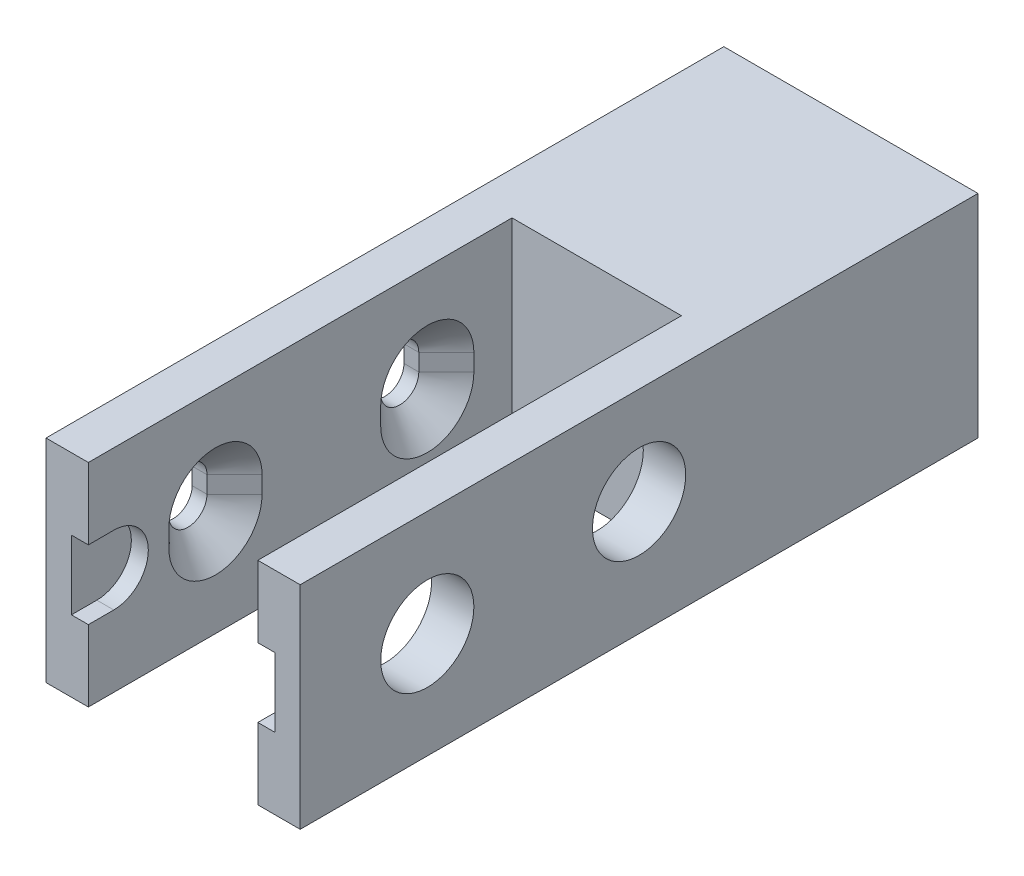
ISO-10303-21;
HEADER;
FILE_DESCRIPTION(('STEP AP214'),'2;1');
FILE_NAME('part.step','',(''),(''),'','','');
FILE_SCHEMA(('AUTOMOTIVE_DESIGN { 1 0 10303 214 1 1 1 1 }'));
ENDSEC;
DATA;
#1=APPLICATION_CONTEXT('core data for automotive mechanical design processes');
#2=APPLICATION_PROTOCOL_DEFINITION('international standard','automotive_design',2000,#1);
#3=PRODUCT_CONTEXT('',#1,'mechanical');
#4=PRODUCT('Part','Part','',(#3));
#5=PRODUCT_RELATED_PRODUCT_CATEGORY('part','',(#4));
#6=PRODUCT_DEFINITION_FORMATION('','',#4);
#7=PRODUCT_DEFINITION_CONTEXT('part definition',#1,'design');
#8=PRODUCT_DEFINITION('design','',#6,#7);
#9=PRODUCT_DEFINITION_SHAPE('','',#8);
#10=(LENGTH_UNIT() NAMED_UNIT(*) SI_UNIT(.MILLI.,.METRE.));
#11=(NAMED_UNIT(*) PLANE_ANGLE_UNIT() SI_UNIT($,.RADIAN.));
#12=(NAMED_UNIT(*) SI_UNIT($,.STERADIAN.) SOLID_ANGLE_UNIT());
#13=UNCERTAINTY_MEASURE_WITH_UNIT(LENGTH_MEASURE(1.E-05),#10,'distance_accuracy_value','');
#14=(GEOMETRIC_REPRESENTATION_CONTEXT(3) GLOBAL_UNCERTAINTY_ASSIGNED_CONTEXT((#13)) GLOBAL_UNIT_ASSIGNED_CONTEXT((#10,
#11,#12)) REPRESENTATION_CONTEXT('',''));
#15=CARTESIAN_POINT('',(0.,0.,0.));
#16=DIRECTION('',(0.,0.,1.));
#17=DIRECTION('',(1.,0.,0.));
#18=AXIS2_PLACEMENT_3D('',#15,#16,#17);
#19=CARTESIAN_POINT('',(10.,25.,0.));
#20=DIRECTION('',(1.,0.,0.));
#21=DIRECTION('',(0.,0.,-1.));
#22=AXIS2_PLACEMENT_3D('',#19,#20,#21);
#23=PLANE('',#22);
#24=CARTESIAN_POINT('',(10.,13.5,0.));
#25=DIRECTION('',(1.,0.,0.));
#26=DIRECTION('',(0.,0.,-1.));
#27=AXIS2_PLACEMENT_3D('',#24,#25,#26);
#28=CIRCLE('',#27,5.5);
#29=CARTESIAN_POINT('',(10.,13.5,-5.50000000000001));
#30=VERTEX_POINT('',#29);
#31=EDGE_CURVE('E652',#30,#30,#28,.F.);
#32=ORIENTED_EDGE('',*,*,#31,.F.);
#33=EDGE_LOOP('',(#32));
#34=FACE_BOUND('',#33,.T.);
#35=CARTESIAN_POINT('',(10.,12.5,25.));
#36=DIRECTION('',(1.,0.,0.));
#37=DIRECTION('',(0.,0.,-1.));
#38=AXIS2_PLACEMENT_3D('',#35,#36,#37);
#39=CIRCLE('',#38,5.5);
#40=CARTESIAN_POINT('',(10.,12.5,19.5));
#41=VERTEX_POINT('',#40);
#42=EDGE_CURVE('E648',#41,#41,#39,.F.);
#43=ORIENTED_EDGE('',*,*,#42,.F.);
#44=EDGE_LOOP('',(#43));
#45=FACE_BOUND('',#44,.T.);
#46=DIRECTION('',(0.,0.,1.));
#47=VECTOR('',#46,1.);
#48=CARTESIAN_POINT('',(10.,16.575,37.));
#49=LINE('',#48,#47);
#50=CARTESIAN_POINT('',(10.,16.575,37.));
#51=VERTEX_POINT('',#50);
#52=CARTESIAN_POINT('',(10.,16.575,40.));
#53=VERTEX_POINT('',#52);
#54=EDGE_CURVE('E597',#51,#53,#49,.T.);
#55=ORIENTED_EDGE('',*,*,#54,.T.);
#56=DIRECTION('',(0.,-1.,0.));
#57=VECTOR('',#56,1.);
#58=CARTESIAN_POINT('',(10.,25.,40.));
#59=LINE('',#58,#57);
#60=CARTESIAN_POINT('',(10.,25.,40.));
#61=VERTEX_POINT('',#60);
#62=EDGE_CURVE('E830',#61,#53,#59,.T.);
#63=ORIENTED_EDGE('',*,*,#62,.F.);
#64=DIRECTION('',(0.,0.,1.));
#65=VECTOR('',#64,1.);
#66=CARTESIAN_POINT('',(10.,25.,0.));
#67=LINE('',#66,#65);
#68=CARTESIAN_POINT('',(10.,25.,-10.));
#69=VERTEX_POINT('',#68);
#70=EDGE_CURVE('E778',#69,#61,#67,.T.);
#71=ORIENTED_EDGE('',*,*,#70,.F.);
#72=DIRECTION('',(0.,-1.,0.));
#73=VECTOR('',#72,1.);
#74=CARTESIAN_POINT('',(10.,25.,-10.));
#75=LINE('',#74,#73);
#76=CARTESIAN_POINT('',(10.,0.,-10.));
#77=VERTEX_POINT('',#76);
#78=EDGE_CURVE('E832',#69,#77,#75,.T.);
#79=ORIENTED_EDGE('',*,*,#78,.T.);
#80=DIRECTION('',(0.,0.,1.));
#81=VECTOR('',#80,1.);
#82=CARTESIAN_POINT('',(10.,0.,0.));
#83=LINE('',#82,#81);
#84=CARTESIAN_POINT('',(10.,0.,40.));
#85=VERTEX_POINT('',#84);
#86=EDGE_CURVE('E798',#77,#85,#83,.T.);
#87=ORIENTED_EDGE('',*,*,#86,.T.);
#88=CARTESIAN_POINT('',(10.,8.42500000000001,40.));
#89=VERTEX_POINT('',#88);
#90=EDGE_CURVE('E829',#89,#85,#59,.T.);
#91=ORIENTED_EDGE('',*,*,#90,.F.);
#92=DIRECTION('',(0.,0.,1.));
#93=VECTOR('',#92,1.);
#94=CARTESIAN_POINT('',(10.,8.42500000000001,37.));
#95=LINE('',#94,#93);
#96=CARTESIAN_POINT('',(10.,8.42500000000001,37.));
#97=VERTEX_POINT('',#96);
#98=EDGE_CURVE('E619',#97,#89,#95,.T.);
#99=ORIENTED_EDGE('',*,*,#98,.F.);
#100=CARTESIAN_POINT('',(10.,12.5,37.));
#101=DIRECTION('',(-1.,0.,0.));
#102=DIRECTION('',(0.,0.,1.));
#103=AXIS2_PLACEMENT_3D('',#100,#101,#102);
#104=CIRCLE('',#103,4.07499999999999);
#105=EDGE_CURVE('E614',#51,#97,#104,.T.);
#106=ORIENTED_EDGE('',*,*,#105,.F.);
#107=EDGE_LOOP('',(#55,#63,#71,#79,#87,#91,#99,#106));
#108=FACE_BOUND('',#107,.T.);
#109=ADVANCED_FACE('F412',(#34,#45,#108),#23,.F.);
#110=CARTESIAN_POINT('',(-15.,25.,0.));
#111=DIRECTION('',(1.,0.,0.));
#112=DIRECTION('',(0.,0.,-1.));
#113=AXIS2_PLACEMENT_3D('',#110,#111,#112);
#114=PLANE('',#113);
#115=DIRECTION('',(0.,1.,0.));
#116=VECTOR('',#115,1.);
#117=CARTESIAN_POINT('',(-15.,11.5,2.25));
#118=LINE('',#117,#116);
#119=CARTESIAN_POINT('',(-15.,11.5,2.25));
#120=VERTEX_POINT('',#119);
#121=CARTESIAN_POINT('',(-15.,13.5,2.25));
#122=VERTEX_POINT('',#121);
#123=EDGE_CURVE('E667',#120,#122,#118,.T.);
#124=ORIENTED_EDGE('',*,*,#123,.F.);
#125=CARTESIAN_POINT('',(-15.,11.5,0.));
#126=DIRECTION('',(1.,0.,0.));
#127=DIRECTION('',(0.,0.,-1.));
#128=AXIS2_PLACEMENT_3D('',#125,#126,#127);
#129=CIRCLE('',#128,2.25);
#130=CARTESIAN_POINT('',(-15.,11.5,-2.24999999999999));
#131=VERTEX_POINT('',#130);
#132=EDGE_CURVE('E686',#120,#131,#129,.T.);
#133=ORIENTED_EDGE('',*,*,#132,.T.);
#134=DIRECTION('',(0.,1.,0.));
#135=VECTOR('',#134,1.);
#136=CARTESIAN_POINT('',(-15.,11.5,-2.24999999999999));
#137=LINE('',#136,#135);
#138=CARTESIAN_POINT('',(-15.,13.5,-2.25));
#139=VERTEX_POINT('',#138);
#140=EDGE_CURVE('E664',#131,#139,#137,.T.);
#141=ORIENTED_EDGE('',*,*,#140,.T.);
#142=CARTESIAN_POINT('',(-15.,13.5,0.));
#143=DIRECTION('',(1.,0.,0.));
#144=DIRECTION('',(0.,0.,-1.));
#145=AXIS2_PLACEMENT_3D('',#142,#143,#144);
#146=CIRCLE('',#145,2.25);
#147=EDGE_CURVE('E705',#139,#122,#146,.T.);
#148=ORIENTED_EDGE('',*,*,#147,.T.);
#149=EDGE_LOOP('',(#124,#133,#141,#148));
#150=FACE_BOUND('',#149,.T.);
#151=DIRECTION('',(0.,0.,1.));
#152=VECTOR('',#151,1.);
#153=CARTESIAN_POINT('',(-15.,0.,0.));
#154=LINE('',#153,#152);
#155=CARTESIAN_POINT('',(-15.,0.,-40.));
#156=VERTEX_POINT('',#155);
#157=CARTESIAN_POINT('',(-15.,0.,40.));
#158=VERTEX_POINT('',#157);
#159=EDGE_CURVE('E811',#156,#158,#154,.T.);
#160=ORIENTED_EDGE('',*,*,#159,.T.);
#161=DIRECTION('',(0.,-1.,0.));
#162=VECTOR('',#161,1.);
#163=CARTESIAN_POINT('',(-15.,25.,40.));
#164=LINE('',#163,#162);
#165=CARTESIAN_POINT('',(-15.,25.,40.));
#166=VERTEX_POINT('',#165);
#167=EDGE_CURVE('E820',#166,#158,#164,.T.);
#168=ORIENTED_EDGE('',*,*,#167,.F.);
#169=DIRECTION('',(0.,0.,1.));
#170=VECTOR('',#169,1.);
#171=CARTESIAN_POINT('',(-15.,25.,0.));
#172=LINE('',#171,#170);
#173=CARTESIAN_POINT('',(-15.,25.,-40.));
#174=VERTEX_POINT('',#173);
#175=EDGE_CURVE('E790',#174,#166,#172,.T.);
#176=ORIENTED_EDGE('',*,*,#175,.F.);
#177=DIRECTION('',(0.,-1.,0.));
#178=VECTOR('',#177,1.);
#179=CARTESIAN_POINT('',(-15.,25.,-40.));
#180=LINE('',#179,#178);
#181=EDGE_CURVE('E823',#174,#156,#180,.T.);
#182=ORIENTED_EDGE('',*,*,#181,.T.);
#183=EDGE_LOOP('',(#160,#168,#176,#182));
#184=FACE_BOUND('',#183,.T.);
#185=DIRECTION('',(0.,1.,0.));
#186=VECTOR('',#185,1.);
#187=CARTESIAN_POINT('',(-15.,11.5,27.25));
#188=LINE('',#187,#186);
#189=CARTESIAN_POINT('',(-15.,11.5,27.25));
#190=VERTEX_POINT('',#189);
#191=CARTESIAN_POINT('',(-15.,13.5,27.25));
#192=VERTEX_POINT('',#191);
#193=EDGE_CURVE('E723',#190,#192,#188,.T.);
#194=ORIENTED_EDGE('',*,*,#193,.F.);
#195=CARTESIAN_POINT('',(-15.,11.5,25.));
#196=DIRECTION('',(1.,0.,0.));
#197=DIRECTION('',(0.,0.,-1.));
#198=AXIS2_PLACEMENT_3D('',#195,#196,#197);
#199=CIRCLE('',#198,2.25);
#200=CARTESIAN_POINT('',(-15.,11.5,22.75));
#201=VERTEX_POINT('',#200);
#202=EDGE_CURVE('E741',#190,#201,#199,.T.);
#203=ORIENTED_EDGE('',*,*,#202,.T.);
#204=DIRECTION('',(0.,1.,0.));
#205=VECTOR('',#204,1.);
#206=CARTESIAN_POINT('',(-15.,11.5,22.75));
#207=LINE('',#206,#205);
#208=CARTESIAN_POINT('',(-15.,13.5,22.75));
#209=VERTEX_POINT('',#208);
#210=EDGE_CURVE('E720',#201,#209,#207,.T.);
#211=ORIENTED_EDGE('',*,*,#210,.T.);
#212=CARTESIAN_POINT('',(-15.,13.5,25.));
#213=DIRECTION('',(1.,0.,0.));
#214=DIRECTION('',(0.,0.,-1.));
#215=AXIS2_PLACEMENT_3D('',#212,#213,#214);
#216=CIRCLE('',#215,2.25);
#217=EDGE_CURVE('E760',#209,#192,#216,.T.);
#218=ORIENTED_EDGE('',*,*,#217,.T.);
#219=EDGE_LOOP('',(#194,#203,#211,#218));
#220=FACE_BOUND('',#219,.T.);
#221=ADVANCED_FACE('F862',(#150,#184,#220),#114,.F.);
#222=CARTESIAN_POINT('',(0.,25.,-10.));
#223=DIRECTION('',(0.,0.,-1.));
#224=DIRECTION('',(-1.,0.,0.));
#225=AXIS2_PLACEMENT_3D('',#222,#223,#224);
#226=PLANE('',#225);
#227=DIRECTION('',(1.,0.,0.));
#228=VECTOR('',#227,1.);
#229=CARTESIAN_POINT('',(0.,0.,-10.));
#230=LINE('',#229,#228);
#231=CARTESIAN_POINT('',(-10.,0.,-10.));
#232=VERTEX_POINT('',#231);
#233=EDGE_CURVE('E772',#232,#77,#230,.T.);
#234=ORIENTED_EDGE('',*,*,#233,.T.);
#235=ORIENTED_EDGE('',*,*,#78,.F.);
#236=DIRECTION('',(1.,0.,0.));
#237=VECTOR('',#236,1.);
#238=CARTESIAN_POINT('',(0.,25.,-10.));
#239=LINE('',#238,#237);
#240=CARTESIAN_POINT('',(-10.,25.,-10.));
#241=VERTEX_POINT('',#240);
#242=EDGE_CURVE('E775',#241,#69,#239,.T.);
#243=ORIENTED_EDGE('',*,*,#242,.F.);
#244=DIRECTION('',(0.,-1.,0.));
#245=VECTOR('',#244,1.);
#246=CARTESIAN_POINT('',(-10.,25.,-10.));
#247=LINE('',#246,#245);
#248=EDGE_CURVE('E795',#241,#232,#247,.T.);
#249=ORIENTED_EDGE('',*,*,#248,.T.);
#250=EDGE_LOOP('',(#234,#235,#243,#249));
#251=FACE_BOUND('',#250,.T.);
#252=ADVANCED_FACE('F414',(#251),#226,.F.);
#253=CARTESIAN_POINT('',(0.,25.,40.));
#254=DIRECTION('',(0.,0.,-1.));
#255=DIRECTION('',(-1.,0.,0.));
#256=AXIS2_PLACEMENT_3D('',#253,#254,#255);
#257=PLANE('',#256);
#258=DIRECTION('',(0.,-1.,0.));
#259=VECTOR('',#258,1.);
#260=CARTESIAN_POINT('',(12.,25.,40.));
#261=LINE('',#260,#259);
#262=CARTESIAN_POINT('',(12.,16.575,40.));
#263=VERTEX_POINT('',#262);
#264=CARTESIAN_POINT('',(12.,8.425,40.));
#265=VERTEX_POINT('',#264);
#266=EDGE_CURVE('E841',#263,#265,#261,.T.);
#267=ORIENTED_EDGE('',*,*,#266,.T.);
#268=DIRECTION('',(-1.,0.,0.));
#269=VECTOR('',#268,1.);
#270=CARTESIAN_POINT('',(0.,8.42500000000001,40.));
#271=LINE('',#270,#269);
#272=EDGE_CURVE('E13',#265,#89,#271,.T.);
#273=ORIENTED_EDGE('',*,*,#272,.T.);
#274=ORIENTED_EDGE('',*,*,#90,.T.);
#275=DIRECTION('',(1.,0.,0.));
#276=VECTOR('',#275,1.);
#277=CARTESIAN_POINT('',(0.,0.,40.));
#278=LINE('',#277,#276);
#279=CARTESIAN_POINT('',(15.,0.,40.));
#280=VERTEX_POINT('',#279);
#281=EDGE_CURVE('E801',#85,#280,#278,.T.);
#282=ORIENTED_EDGE('',*,*,#281,.T.);
#283=DIRECTION('',(0.,-1.,0.));
#284=VECTOR('',#283,1.);
#285=CARTESIAN_POINT('',(15.,25.,40.));
#286=LINE('',#285,#284);
#287=CARTESIAN_POINT('',(15.,25.,40.));
#288=VERTEX_POINT('',#287);
#289=EDGE_CURVE('E827',#288,#280,#286,.T.);
#290=ORIENTED_EDGE('',*,*,#289,.F.);
#291=DIRECTION('',(1.,0.,0.));
#292=VECTOR('',#291,1.);
#293=CARTESIAN_POINT('',(0.,25.,40.));
#294=LINE('',#293,#292);
#295=EDGE_CURVE('E781',#61,#288,#294,.T.);
#296=ORIENTED_EDGE('',*,*,#295,.F.);
#297=ORIENTED_EDGE('',*,*,#62,.T.);
#298=DIRECTION('',(-1.,0.,0.));
#299=VECTOR('',#298,1.);
#300=CARTESIAN_POINT('',(0.,16.5749999999999,40.));
#301=LINE('',#300,#299);
#302=EDGE_CURVE('E420',#263,#53,#301,.T.);
#303=ORIENTED_EDGE('',*,*,#302,.F.);
#304=EDGE_LOOP('',(#267,#273,#274,#282,#290,#296,#297,#303));
#305=FACE_BOUND('',#304,.T.);
#306=ADVANCED_FACE('F844',(#305),#257,.F.);
#307=CARTESIAN_POINT('',(15.,25.,0.));
#308=DIRECTION('',(1.,0.,0.));
#309=DIRECTION('',(0.,0.,-1.));
#310=AXIS2_PLACEMENT_3D('',#307,#308,#309);
#311=PLANE('',#310);
#312=CARTESIAN_POINT('',(15.,12.5,25.));
#313=DIRECTION('',(1.,0.,0.));
#314=DIRECTION('',(0.,0.,-1.));
#315=AXIS2_PLACEMENT_3D('',#312,#313,#314);
#316=CIRCLE('',#315,5.5);
#317=CARTESIAN_POINT('',(15.,12.5,19.5));
#318=VERTEX_POINT('',#317);
#319=EDGE_CURVE('E651',#318,#318,#316,.T.);
#320=ORIENTED_EDGE('',*,*,#319,.F.);
#321=EDGE_LOOP('',(#320));
#322=FACE_BOUND('',#321,.T.);
#323=CARTESIAN_POINT('',(15.,13.5,0.));
#324=DIRECTION('',(1.,0.,0.));
#325=DIRECTION('',(0.,0.,-1.));
#326=AXIS2_PLACEMENT_3D('',#323,#324,#325);
#327=CIRCLE('',#326,5.5);
#328=CARTESIAN_POINT('',(15.,13.5,-5.50000000000001));
#329=VERTEX_POINT('',#328);
#330=EDGE_CURVE('E647',#329,#329,#327,.T.);
#331=ORIENTED_EDGE('',*,*,#330,.F.);
#332=EDGE_LOOP('',(#331));
#333=FACE_BOUND('',#332,.T.);
#334=DIRECTION('',(0.,0.,1.));
#335=VECTOR('',#334,1.);
#336=CARTESIAN_POINT('',(15.,0.,0.));
#337=LINE('',#336,#335);
#338=CARTESIAN_POINT('',(15.,0.,-40.));
#339=VERTEX_POINT('',#338);
#340=EDGE_CURVE('E804',#339,#280,#337,.T.);
#341=ORIENTED_EDGE('',*,*,#340,.F.);
#342=DIRECTION('',(0.,-1.,0.));
#343=VECTOR('',#342,1.);
#344=CARTESIAN_POINT('',(15.,25.,-40.));
#345=LINE('',#344,#343);
#346=CARTESIAN_POINT('',(15.,25.,-40.));
#347=VERTEX_POINT('',#346);
#348=EDGE_CURVE('E825',#347,#339,#345,.T.);
#349=ORIENTED_EDGE('',*,*,#348,.F.);
#350=DIRECTION('',(0.,0.,1.));
#351=VECTOR('',#350,1.);
#352=CARTESIAN_POINT('',(15.,25.,0.));
#353=LINE('',#352,#351);
#354=EDGE_CURVE('E783',#347,#288,#353,.T.);
#355=ORIENTED_EDGE('',*,*,#354,.T.);
#356=ORIENTED_EDGE('',*,*,#289,.T.);
#357=EDGE_LOOP('',(#341,#349,#355,#356));
#358=FACE_BOUND('',#357,.T.);
#359=ADVANCED_FACE('F872',(#322,#333,#358),#311,.T.);
#360=CARTESIAN_POINT('',(0.,25.,-40.));
#361=DIRECTION('',(0.,0.,-1.));
#362=DIRECTION('',(-1.,0.,0.));
#363=AXIS2_PLACEMENT_3D('',#360,#361,#362);
#364=PLANE('',#363);
#365=CARTESIAN_POINT('',(0.,12.5,-40.));
#366=DIRECTION('',(0.,0.,-1.));
#367=DIRECTION('',(-1.,0.,0.));
#368=AXIS2_PLACEMENT_3D('',#365,#366,#367);
#369=CIRCLE('',#368,4.1);
#370=CARTESIAN_POINT('',(-4.1,12.5,-40.));
#371=VERTEX_POINT('',#370);
#372=EDGE_CURVE('E768',#371,#371,#369,.T.);
#373=ORIENTED_EDGE('',*,*,#372,.F.);
#374=EDGE_LOOP('',(#373));
#375=FACE_BOUND('',#374,.T.);
#376=DIRECTION('',(1.,0.,0.));
#377=VECTOR('',#376,1.);
#378=CARTESIAN_POINT('',(0.,0.,-40.));
#379=LINE('',#378,#377);
#380=EDGE_CURVE('E808',#156,#339,#379,.T.);
#381=ORIENTED_EDGE('',*,*,#380,.F.);
#382=ORIENTED_EDGE('',*,*,#181,.F.);
#383=DIRECTION('',(1.,0.,0.));
#384=VECTOR('',#383,1.);
#385=CARTESIAN_POINT('',(0.,25.,-40.));
#386=LINE('',#385,#384);
#387=EDGE_CURVE('E787',#174,#347,#386,.T.);
#388=ORIENTED_EDGE('',*,*,#387,.T.);
#389=ORIENTED_EDGE('',*,*,#348,.T.);
#390=EDGE_LOOP('',(#381,#382,#388,#389));
#391=FACE_BOUND('',#390,.T.);
#392=ADVANCED_FACE('F875',(#375,#391),#364,.T.);
#393=DIRECTION('',(0.,-1.,0.));
#394=VECTOR('',#393,1.);
#395=CARTESIAN_POINT('',(-10.,25.,40.));
#396=LINE('',#395,#394);
#397=CARTESIAN_POINT('',(-9.99999999999999,8.42500000000001,40.));
#398=VERTEX_POINT('',#397);
#399=CARTESIAN_POINT('',(-10.,0.,40.));
#400=VERTEX_POINT('',#399);
#401=EDGE_CURVE('E816',#398,#400,#396,.T.);
#402=ORIENTED_EDGE('',*,*,#401,.F.);
#403=DIRECTION('',(-1.,0.,0.));
#404=VECTOR('',#403,1.);
#405=CARTESIAN_POINT('',(0.,8.42500000000001,40.));
#406=LINE('',#405,#404);
#407=CARTESIAN_POINT('',(-12.,8.42500000000001,40.));
#408=VERTEX_POINT('',#407);
#409=EDGE_CURVE('E838',#398,#408,#406,.T.);
#410=ORIENTED_EDGE('',*,*,#409,.T.);
#411=DIRECTION('',(0.,1.,0.));
#412=VECTOR('',#411,1.);
#413=CARTESIAN_POINT('',(-12.,25.,40.));
#414=LINE('',#413,#412);
#415=CARTESIAN_POINT('',(-12.,16.575,40.));
#416=VERTEX_POINT('',#415);
#417=EDGE_CURVE('E835',#408,#416,#414,.T.);
#418=ORIENTED_EDGE('',*,*,#417,.T.);
#419=DIRECTION('',(1.,0.,0.));
#420=VECTOR('',#419,1.);
#421=CARTESIAN_POINT('',(0.,16.5749999999999,40.));
#422=LINE('',#421,#420);
#423=CARTESIAN_POINT('',(-9.99999999999999,16.575,40.));
#424=VERTEX_POINT('',#423);
#425=EDGE_CURVE('E644',#416,#424,#422,.T.);
#426=ORIENTED_EDGE('',*,*,#425,.T.);
#427=CARTESIAN_POINT('',(-10.,25.,40.));
#428=VERTEX_POINT('',#427);
#429=EDGE_CURVE('E817',#428,#424,#396,.T.);
#430=ORIENTED_EDGE('',*,*,#429,.F.);
#431=EDGE_CURVE('E784',#166,#428,#294,.T.);
#432=ORIENTED_EDGE('',*,*,#431,.F.);
#433=ORIENTED_EDGE('',*,*,#167,.T.);
#434=EDGE_CURVE('E805',#158,#400,#278,.T.);
#435=ORIENTED_EDGE('',*,*,#434,.T.);
#436=EDGE_LOOP('',(#402,#410,#418,#426,#430,#432,#433,#435));
#437=FACE_BOUND('',#436,.T.);
#438=ADVANCED_FACE('F878',(#437),#257,.F.);
#439=CARTESIAN_POINT('',(-10.,25.,0.));
#440=DIRECTION('',(1.,0.,0.));
#441=DIRECTION('',(0.,0.,-1.));
#442=AXIS2_PLACEMENT_3D('',#439,#440,#441);
#443=PLANE('',#442);
#444=DIRECTION('',(0.,0.,1.));
#445=VECTOR('',#444,1.);
#446=CARTESIAN_POINT('',(-9.99999999999999,16.575,37.));
#447=LINE('',#446,#445);
#448=CARTESIAN_POINT('',(-9.99999999999999,16.575,37.));
#449=VERTEX_POINT('',#448);
#450=EDGE_CURVE('E625',#449,#424,#447,.T.);
#451=ORIENTED_EDGE('',*,*,#450,.F.);
#452=CARTESIAN_POINT('',(-9.99999999999999,12.5,37.));
#453=DIRECTION('',(1.,0.,0.));
#454=DIRECTION('',(0.,0.,-1.));
#455=AXIS2_PLACEMENT_3D('',#452,#453,#454);
#456=CIRCLE('',#455,4.07499999999999);
#457=CARTESIAN_POINT('',(-9.99999999999999,8.42500000000001,37.));
#458=VERTEX_POINT('',#457);
#459=EDGE_CURVE('E639',#458,#449,#456,.T.);
#460=ORIENTED_EDGE('',*,*,#459,.F.);
#461=DIRECTION('',(0.,0.,1.));
#462=VECTOR('',#461,1.);
#463=CARTESIAN_POINT('',(-9.99999999999999,8.42500000000001,37.));
#464=LINE('',#463,#462);
#465=EDGE_CURVE('E633',#458,#398,#464,.T.);
#466=ORIENTED_EDGE('',*,*,#465,.T.);
#467=ORIENTED_EDGE('',*,*,#401,.T.);
#468=DIRECTION('',(0.,0.,1.));
#469=VECTOR('',#468,1.);
#470=CARTESIAN_POINT('',(-10.,0.,0.));
#471=LINE('',#470,#469);
#472=EDGE_CURVE('E779',#232,#400,#471,.T.);
#473=ORIENTED_EDGE('',*,*,#472,.F.);
#474=ORIENTED_EDGE('',*,*,#248,.F.);
#475=DIRECTION('',(0.,0.,1.));
#476=VECTOR('',#475,1.);
#477=CARTESIAN_POINT('',(-10.,25.,0.));
#478=LINE('',#477,#476);
#479=EDGE_CURVE('E792',#241,#428,#478,.T.);
#480=ORIENTED_EDGE('',*,*,#479,.T.);
#481=ORIENTED_EDGE('',*,*,#429,.T.);
#482=EDGE_LOOP('',(#451,#460,#466,#467,#473,#474,#480,#481));
#483=FACE_BOUND('',#482,.T.);
#484=CARTESIAN_POINT('',(-10.,11.5,0.));
#485=DIRECTION('',(1.,0.,0.));
#486=DIRECTION('',(0.,0.,-1.));
#487=AXIS2_PLACEMENT_3D('',#484,#485,#486);
#488=CIRCLE('',#487,5.5);
#489=CARTESIAN_POINT('',(-10.,11.5,5.50000000000001));
#490=VERTEX_POINT('',#489);
#491=CARTESIAN_POINT('',(-10.,11.5,-5.5));
#492=VERTEX_POINT('',#491);
#493=EDGE_CURVE('E680',#490,#492,#488,.T.);
#494=ORIENTED_EDGE('',*,*,#493,.F.);
#495=DIRECTION('',(0.,1.,0.));
#496=VECTOR('',#495,1.);
#497=CARTESIAN_POINT('',(-10.,11.5,5.50000000000001));
#498=LINE('',#497,#496);
#499=CARTESIAN_POINT('',(-10.,13.5,5.5));
#500=VERTEX_POINT('',#499);
#501=EDGE_CURVE('E671',#490,#500,#498,.T.);
#502=ORIENTED_EDGE('',*,*,#501,.T.);
#503=CARTESIAN_POINT('',(-10.,13.5,0.));
#504=DIRECTION('',(1.,0.,0.));
#505=DIRECTION('',(0.,0.,-1.));
#506=AXIS2_PLACEMENT_3D('',#503,#504,#505);
#507=CIRCLE('',#506,5.5);
#508=CARTESIAN_POINT('',(-10.,13.5,-5.50000000000001));
#509=VERTEX_POINT('',#508);
#510=EDGE_CURVE('E700',#509,#500,#507,.T.);
#511=ORIENTED_EDGE('',*,*,#510,.F.);
#512=DIRECTION('',(0.,1.,0.));
#513=VECTOR('',#512,1.);
#514=CARTESIAN_POINT('',(-10.,11.5,-5.5));
#515=LINE('',#514,#513);
#516=EDGE_CURVE('E655',#492,#509,#515,.T.);
#517=ORIENTED_EDGE('',*,*,#516,.F.);
#518=EDGE_LOOP('',(#494,#502,#511,#517));
#519=FACE_BOUND('',#518,.T.);
#520=CARTESIAN_POINT('',(-10.,11.5,25.));
#521=DIRECTION('',(1.,0.,0.));
#522=DIRECTION('',(0.,0.,-1.));
#523=AXIS2_PLACEMENT_3D('',#520,#521,#522);
#524=CIRCLE('',#523,5.5);
#525=CARTESIAN_POINT('',(-10.,11.5,30.5));
#526=VERTEX_POINT('',#525);
#527=CARTESIAN_POINT('',(-10.,11.5,19.5));
#528=VERTEX_POINT('',#527);
#529=EDGE_CURVE('E735',#526,#528,#524,.T.);
#530=ORIENTED_EDGE('',*,*,#529,.F.);
#531=DIRECTION('',(0.,1.,0.));
#532=VECTOR('',#531,1.);
#533=CARTESIAN_POINT('',(-10.,11.5,30.5));
#534=LINE('',#533,#532);
#535=CARTESIAN_POINT('',(-10.,13.5,30.5));
#536=VERTEX_POINT('',#535);
#537=EDGE_CURVE('E727',#526,#536,#534,.T.);
#538=ORIENTED_EDGE('',*,*,#537,.T.);
#539=CARTESIAN_POINT('',(-10.,13.5,25.));
#540=DIRECTION('',(1.,0.,0.));
#541=DIRECTION('',(0.,0.,-1.));
#542=AXIS2_PLACEMENT_3D('',#539,#540,#541);
#543=CIRCLE('',#542,5.5);
#544=CARTESIAN_POINT('',(-10.,13.5,19.5));
#545=VERTEX_POINT('',#544);
#546=EDGE_CURVE('E754',#545,#536,#543,.T.);
#547=ORIENTED_EDGE('',*,*,#546,.F.);
#548=DIRECTION('',(0.,1.,0.));
#549=VECTOR('',#548,1.);
#550=CARTESIAN_POINT('',(-10.,11.5,19.5));
#551=LINE('',#550,#549);
#552=EDGE_CURVE('E714',#528,#545,#551,.T.);
#553=ORIENTED_EDGE('',*,*,#552,.F.);
#554=EDGE_LOOP('',(#530,#538,#547,#553));
#555=FACE_BOUND('',#554,.T.);
#556=ADVANCED_FACE('F883',(#483,#519,#555),#443,.T.);
#557=CARTESIAN_POINT('',(0.,25.,0.));
#558=DIRECTION('',(0.,1.,0.));
#559=DIRECTION('',(0.,0.,1.));
#560=AXIS2_PLACEMENT_3D('',#557,#558,#559);
#561=PLANE('',#560);
#562=ORIENTED_EDGE('',*,*,#242,.T.);
#563=ORIENTED_EDGE('',*,*,#70,.T.);
#564=ORIENTED_EDGE('',*,*,#295,.T.);
#565=ORIENTED_EDGE('',*,*,#354,.F.);
#566=ORIENTED_EDGE('',*,*,#387,.F.);
#567=ORIENTED_EDGE('',*,*,#175,.T.);
#568=ORIENTED_EDGE('',*,*,#431,.T.);
#569=ORIENTED_EDGE('',*,*,#479,.F.);
#570=EDGE_LOOP('',(#562,#563,#564,#565,#566,#567,#568,#569));
#571=FACE_BOUND('',#570,.T.);
#572=ADVANCED_FACE('F887',(#571),#561,.T.);
#573=CARTESIAN_POINT('',(0.,0.,0.));
#574=DIRECTION('',(0.,1.,0.));
#575=DIRECTION('',(0.,0.,1.));
#576=AXIS2_PLACEMENT_3D('',#573,#574,#575);
#577=PLANE('',#576);
#578=ORIENTED_EDGE('',*,*,#233,.F.);
#579=ORIENTED_EDGE('',*,*,#472,.T.);
#580=ORIENTED_EDGE('',*,*,#434,.F.);
#581=ORIENTED_EDGE('',*,*,#159,.F.);
#582=ORIENTED_EDGE('',*,*,#380,.T.);
#583=ORIENTED_EDGE('',*,*,#340,.T.);
#584=ORIENTED_EDGE('',*,*,#281,.F.);
#585=ORIENTED_EDGE('',*,*,#86,.F.);
#586=EDGE_LOOP('',(#578,#579,#580,#581,#582,#583,#584,#585));
#587=FACE_BOUND('',#586,.T.);
#588=ADVANCED_FACE('F889',(#587),#577,.F.);
#589=CARTESIAN_POINT('',(0.,12.5,-20.));
#590=DIRECTION('',(0.,0.,-1.));
#591=DIRECTION('',(-1.,0.,0.));
#592=AXIS2_PLACEMENT_3D('',#589,#590,#591);
#593=CYLINDRICAL_SURFACE('',#592,4.1);
#594=CARTESIAN_POINT('',(0.,12.5,-20.));
#595=DIRECTION('',(0.,0.,-1.));
#596=DIRECTION('',(-1.,0.,0.));
#597=AXIS2_PLACEMENT_3D('',#594,#595,#596);
#598=CIRCLE('',#597,4.1);
#599=CARTESIAN_POINT('',(-4.1,12.5,-20.));
#600=VERTEX_POINT('',#599);
#601=EDGE_CURVE('E769',#600,#600,#598,.T.);
#602=ORIENTED_EDGE('',*,*,#601,.F.);
#603=EDGE_LOOP('',(#602));
#604=FACE_BOUND('',#603,.T.);
#605=ORIENTED_EDGE('',*,*,#372,.T.);
#606=EDGE_LOOP('',(#605));
#607=FACE_BOUND('',#606,.T.);
#608=ADVANCED_FACE('F892',(#604,#607),#593,.F.);
#609=CARTESIAN_POINT('',(0.,12.5,-20.));
#610=DIRECTION('',(0.,0.,-1.));
#611=DIRECTION('',(-1.,0.,0.));
#612=AXIS2_PLACEMENT_3D('',#609,#610,#611);
#613=PLANE('',#612);
#614=ORIENTED_EDGE('',*,*,#601,.T.);
#615=EDGE_LOOP('',(#614));
#616=FACE_BOUND('',#615,.T.);
#617=ADVANCED_FACE('F899',(#616),#613,.T.);
#618=CARTESIAN_POINT('',(-10.,13.5,25.));
#619=DIRECTION('',(1.,0.,0.));
#620=DIRECTION('',(0.,0.,-1.));
#621=AXIS2_PLACEMENT_3D('',#618,#619,#620);
#622=CYLINDRICAL_SURFACE('',#621,2.25);
#623=ORIENTED_EDGE('',*,*,#217,.F.);
#624=DIRECTION('',(1.,0.,0.));
#625=VECTOR('',#624,1.);
#626=CARTESIAN_POINT('',(-10.,13.5,22.75));
#627=LINE('',#626,#625);
#628=CARTESIAN_POINT('',(-13.25,13.5,22.75));
#629=VERTEX_POINT('',#628);
#630=EDGE_CURVE('E752',#629,#209,#627,.F.);
#631=ORIENTED_EDGE('',*,*,#630,.F.);
#632=CARTESIAN_POINT('',(-13.25,13.5,25.));
#633=DIRECTION('',(1.,0.,0.));
#634=DIRECTION('',(0.,0.,-1.));
#635=AXIS2_PLACEMENT_3D('',#632,#633,#634);
#636=CIRCLE('',#635,2.25);
#637=CARTESIAN_POINT('',(-13.25,13.5,27.25));
#638=VERTEX_POINT('',#637);
#639=EDGE_CURVE('E757',#629,#638,#636,.T.);
#640=ORIENTED_EDGE('',*,*,#639,.T.);
#641=DIRECTION('',(1.,0.,0.));
#642=VECTOR('',#641,1.);
#643=CARTESIAN_POINT('',(-10.,13.5,27.25));
#644=LINE('',#643,#642);
#645=EDGE_CURVE('E749',#192,#638,#644,.T.);
#646=ORIENTED_EDGE('',*,*,#645,.F.);
#647=EDGE_LOOP('',(#623,#631,#640,#646));
#648=FACE_BOUND('',#647,.T.);
#649=ADVANCED_FACE('F903',(#648),#622,.F.);
#650=CARTESIAN_POINT('',(-10.,13.5,25.));
#651=DIRECTION('',(1.,0.,0.));
#652=DIRECTION('',(0.,0.,-1.));
#653=AXIS2_PLACEMENT_3D('',#650,#651,#652);
#654=CONICAL_SURFACE('',#653,5.5,0.785398163397449);
#655=ORIENTED_EDGE('',*,*,#639,.F.);
#656=DIRECTION('',(0.707106781186547,0.,-0.707106781186548));
#657=VECTOR('',#656,1.);
#658=CARTESIAN_POINT('',(-15.5,13.5,25.));
#659=LINE('',#658,#657);
#660=EDGE_CURVE('E765',#545,#629,#659,.F.);
#661=ORIENTED_EDGE('',*,*,#660,.F.);
#662=ORIENTED_EDGE('',*,*,#546,.T.);
#663=DIRECTION('',(-0.707106781186547,0.,-0.707106781186548));
#664=VECTOR('',#663,1.);
#665=CARTESIAN_POINT('',(-15.5,13.5,25.));
#666=LINE('',#665,#664);
#667=EDGE_CURVE('E763',#638,#536,#666,.F.);
#668=ORIENTED_EDGE('',*,*,#667,.F.);
#669=EDGE_LOOP('',(#655,#661,#662,#668));
#670=FACE_BOUND('',#669,.T.);
#671=ADVANCED_FACE('F907',(#670),#654,.F.);
#672=CARTESIAN_POINT('',(-10.,11.5,25.));
#673=DIRECTION('',(1.,0.,0.));
#674=DIRECTION('',(0.,0.,-1.));
#675=AXIS2_PLACEMENT_3D('',#672,#673,#674);
#676=CYLINDRICAL_SURFACE('',#675,2.25);
#677=CARTESIAN_POINT('',(-13.25,11.5,25.));
#678=DIRECTION('',(1.,0.,0.));
#679=DIRECTION('',(0.,0.,-1.));
#680=AXIS2_PLACEMENT_3D('',#677,#678,#679);
#681=CIRCLE('',#680,2.25);
#682=CARTESIAN_POINT('',(-13.25,11.5,27.25));
#683=VERTEX_POINT('',#682);
#684=CARTESIAN_POINT('',(-13.25,11.5,22.75));
#685=VERTEX_POINT('',#684);
#686=EDGE_CURVE('E738',#683,#685,#681,.T.);
#687=ORIENTED_EDGE('',*,*,#686,.T.);
#688=DIRECTION('',(1.,0.,0.));
#689=VECTOR('',#688,1.);
#690=CARTESIAN_POINT('',(-10.,11.5,22.75));
#691=LINE('',#690,#689);
#692=EDGE_CURVE('E730',#201,#685,#691,.T.);
#693=ORIENTED_EDGE('',*,*,#692,.F.);
#694=ORIENTED_EDGE('',*,*,#202,.F.);
#695=DIRECTION('',(1.,0.,0.));
#696=VECTOR('',#695,1.);
#697=CARTESIAN_POINT('',(-10.,11.5,27.25));
#698=LINE('',#697,#696);
#699=EDGE_CURVE('E733',#683,#190,#698,.F.);
#700=ORIENTED_EDGE('',*,*,#699,.F.);
#701=EDGE_LOOP('',(#687,#693,#694,#700));
#702=FACE_BOUND('',#701,.T.);
#703=ADVANCED_FACE('F911',(#702),#676,.F.);
#704=CARTESIAN_POINT('',(-10.,11.5,25.));
#705=DIRECTION('',(1.,0.,0.));
#706=DIRECTION('',(0.,0.,-1.));
#707=AXIS2_PLACEMENT_3D('',#704,#705,#706);
#708=CONICAL_SURFACE('',#707,5.5,0.785398163397449);
#709=ORIENTED_EDGE('',*,*,#529,.T.);
#710=DIRECTION('',(-0.707106781186547,0.,0.707106781186548));
#711=VECTOR('',#710,1.);
#712=CARTESIAN_POINT('',(-15.5,11.5,25.));
#713=LINE('',#712,#711);
#714=EDGE_CURVE('E744',#685,#528,#713,.F.);
#715=ORIENTED_EDGE('',*,*,#714,.F.);
#716=ORIENTED_EDGE('',*,*,#686,.F.);
#717=DIRECTION('',(0.707106781186547,0.,0.707106781186548));
#718=VECTOR('',#717,1.);
#719=CARTESIAN_POINT('',(-15.5,11.5,25.));
#720=LINE('',#719,#718);
#721=EDGE_CURVE('E746',#526,#683,#720,.F.);
#722=ORIENTED_EDGE('',*,*,#721,.F.);
#723=EDGE_LOOP('',(#709,#715,#716,#722));
#724=FACE_BOUND('',#723,.T.);
#725=ADVANCED_FACE('F915',(#724),#708,.F.);
#726=CARTESIAN_POINT('',(-15.5,11.5,25.));
#727=DIRECTION('',(-0.707106781186548,0.,0.707106781186547));
#728=DIRECTION('',(0.707106781186547,0.,0.707106781186548));
#729=AXIS2_PLACEMENT_3D('',#726,#727,#728);
#730=PLANE('',#729);
#731=ORIENTED_EDGE('',*,*,#667,.T.);
#732=ORIENTED_EDGE('',*,*,#537,.F.);
#733=ORIENTED_EDGE('',*,*,#721,.T.);
#734=DIRECTION('',(0.,1.,0.));
#735=VECTOR('',#734,1.);
#736=CARTESIAN_POINT('',(-13.25,11.5,27.25));
#737=LINE('',#736,#735);
#738=EDGE_CURVE('E725',#683,#638,#737,.T.);
#739=ORIENTED_EDGE('',*,*,#738,.T.);
#740=EDGE_LOOP('',(#731,#732,#733,#739));
#741=FACE_BOUND('',#740,.T.);
#742=ADVANCED_FACE('F919',(#741),#730,.F.);
#743=CARTESIAN_POINT('',(-10.,11.5,27.25));
#744=DIRECTION('',(0.,0.,1.));
#745=DIRECTION('',(0.,-1.,0.));
#746=AXIS2_PLACEMENT_3D('',#743,#744,#745);
#747=PLANE('',#746);
#748=ORIENTED_EDGE('',*,*,#645,.T.);
#749=ORIENTED_EDGE('',*,*,#738,.F.);
#750=ORIENTED_EDGE('',*,*,#699,.T.);
#751=ORIENTED_EDGE('',*,*,#193,.T.);
#752=EDGE_LOOP('',(#748,#749,#750,#751));
#753=FACE_BOUND('',#752,.T.);
#754=ADVANCED_FACE('F923',(#753),#747,.F.);
#755=CARTESIAN_POINT('',(-10.,11.5,22.75));
#756=DIRECTION('',(0.,0.,-1.));
#757=DIRECTION('',(0.,1.,0.));
#758=AXIS2_PLACEMENT_3D('',#755,#756,#757);
#759=PLANE('',#758);
#760=ORIENTED_EDGE('',*,*,#630,.T.);
#761=ORIENTED_EDGE('',*,*,#210,.F.);
#762=ORIENTED_EDGE('',*,*,#692,.T.);
#763=DIRECTION('',(0.,1.,0.));
#764=VECTOR('',#763,1.);
#765=CARTESIAN_POINT('',(-13.25,11.5,22.75));
#766=LINE('',#765,#764);
#767=EDGE_CURVE('E717',#685,#629,#766,.T.);
#768=ORIENTED_EDGE('',*,*,#767,.T.);
#769=EDGE_LOOP('',(#760,#761,#762,#768));
#770=FACE_BOUND('',#769,.T.);
#771=ADVANCED_FACE('F927',(#770),#759,.F.);
#772=CARTESIAN_POINT('',(-15.5,11.5,25.));
#773=DIRECTION('',(-0.707106781186548,0.,-0.707106781186547));
#774=DIRECTION('',(-0.707106781186547,0.,0.707106781186548));
#775=AXIS2_PLACEMENT_3D('',#772,#773,#774);
#776=PLANE('',#775);
#777=ORIENTED_EDGE('',*,*,#660,.T.);
#778=ORIENTED_EDGE('',*,*,#767,.F.);
#779=ORIENTED_EDGE('',*,*,#714,.T.);
#780=ORIENTED_EDGE('',*,*,#552,.T.);
#781=EDGE_LOOP('',(#777,#778,#779,#780));
#782=FACE_BOUND('',#781,.T.);
#783=ADVANCED_FACE('F931',(#782),#776,.F.);
#784=CARTESIAN_POINT('',(-10.,13.5,0.));
#785=DIRECTION('',(1.,0.,0.));
#786=DIRECTION('',(0.,0.,-1.));
#787=AXIS2_PLACEMENT_3D('',#784,#785,#786);
#788=CYLINDRICAL_SURFACE('',#787,2.25);
#789=ORIENTED_EDGE('',*,*,#147,.F.);
#790=DIRECTION('',(1.,0.,0.));
#791=VECTOR('',#790,1.);
#792=CARTESIAN_POINT('',(-10.,13.5,-2.25));
#793=LINE('',#792,#791);
#794=CARTESIAN_POINT('',(-13.25,13.5,-2.25));
#795=VERTEX_POINT('',#794);
#796=EDGE_CURVE('E697',#795,#139,#793,.F.);
#797=ORIENTED_EDGE('',*,*,#796,.F.);
#798=CARTESIAN_POINT('',(-13.25,13.5,0.));
#799=DIRECTION('',(1.,0.,0.));
#800=DIRECTION('',(0.,0.,-1.));
#801=AXIS2_PLACEMENT_3D('',#798,#799,#800);
#802=CIRCLE('',#801,2.25);
#803=CARTESIAN_POINT('',(-13.25,13.5,2.25));
#804=VERTEX_POINT('',#803);
#805=EDGE_CURVE('E702',#795,#804,#802,.T.);
#806=ORIENTED_EDGE('',*,*,#805,.T.);
#807=DIRECTION('',(1.,0.,0.));
#808=VECTOR('',#807,1.);
#809=CARTESIAN_POINT('',(-10.,13.5,2.24999999999999));
#810=LINE('',#809,#808);
#811=EDGE_CURVE('E694',#122,#804,#810,.T.);
#812=ORIENTED_EDGE('',*,*,#811,.F.);
#813=EDGE_LOOP('',(#789,#797,#806,#812));
#814=FACE_BOUND('',#813,.T.);
#815=ADVANCED_FACE('F935',(#814),#788,.F.);
#816=CARTESIAN_POINT('',(-10.,13.5,0.));
#817=DIRECTION('',(1.,0.,0.));
#818=DIRECTION('',(0.,0.,-1.));
#819=AXIS2_PLACEMENT_3D('',#816,#817,#818);
#820=CONICAL_SURFACE('',#819,5.5,0.785398163397449);
#821=ORIENTED_EDGE('',*,*,#805,.F.);
#822=DIRECTION('',(0.707106781186547,0.,-0.707106781186548));
#823=VECTOR('',#822,1.);
#824=CARTESIAN_POINT('',(-15.5,13.5,0.));
#825=LINE('',#824,#823);
#826=EDGE_CURVE('E711',#509,#795,#825,.F.);
#827=ORIENTED_EDGE('',*,*,#826,.F.);
#828=ORIENTED_EDGE('',*,*,#510,.T.);
#829=DIRECTION('',(-0.707106781186547,0.,-0.707106781186548));
#830=VECTOR('',#829,1.);
#831=CARTESIAN_POINT('',(-15.5,13.5,0.));
#832=LINE('',#831,#830);
#833=EDGE_CURVE('E708',#804,#500,#832,.F.);
#834=ORIENTED_EDGE('',*,*,#833,.F.);
#835=EDGE_LOOP('',(#821,#827,#828,#834));
#836=FACE_BOUND('',#835,.T.);
#837=ADVANCED_FACE('F939',(#836),#820,.F.);
#838=CARTESIAN_POINT('',(-10.,11.5,0.));
#839=DIRECTION('',(1.,0.,0.));
#840=DIRECTION('',(0.,0.,-1.));
#841=AXIS2_PLACEMENT_3D('',#838,#839,#840);
#842=CYLINDRICAL_SURFACE('',#841,2.25);
#843=CARTESIAN_POINT('',(-13.25,11.5,0.));
#844=DIRECTION('',(1.,0.,0.));
#845=DIRECTION('',(0.,0.,-1.));
#846=AXIS2_PLACEMENT_3D('',#843,#844,#845);
#847=CIRCLE('',#846,2.25);
#848=CARTESIAN_POINT('',(-13.25,11.5,2.25));
#849=VERTEX_POINT('',#848);
#850=CARTESIAN_POINT('',(-13.25,11.5,-2.25));
#851=VERTEX_POINT('',#850);
#852=EDGE_CURVE('E683',#849,#851,#847,.T.);
#853=ORIENTED_EDGE('',*,*,#852,.T.);
#854=DIRECTION('',(1.,0.,0.));
#855=VECTOR('',#854,1.);
#856=CARTESIAN_POINT('',(-10.,11.5,-2.25));
#857=LINE('',#856,#855);
#858=EDGE_CURVE('E674',#131,#851,#857,.T.);
#859=ORIENTED_EDGE('',*,*,#858,.F.);
#860=ORIENTED_EDGE('',*,*,#132,.F.);
#861=DIRECTION('',(1.,0.,0.));
#862=VECTOR('',#861,1.);
#863=CARTESIAN_POINT('',(-10.,11.5,2.25));
#864=LINE('',#863,#862);
#865=EDGE_CURVE('E677',#849,#120,#864,.F.);
#866=ORIENTED_EDGE('',*,*,#865,.F.);
#867=EDGE_LOOP('',(#853,#859,#860,#866));
#868=FACE_BOUND('',#867,.T.);
#869=ADVANCED_FACE('F943',(#868),#842,.F.);
#870=CARTESIAN_POINT('',(-10.,11.5,0.));
#871=DIRECTION('',(1.,0.,0.));
#872=DIRECTION('',(0.,0.,-1.));
#873=AXIS2_PLACEMENT_3D('',#870,#871,#872);
#874=CONICAL_SURFACE('',#873,5.5,0.785398163397449);
#875=ORIENTED_EDGE('',*,*,#493,.T.);
#876=DIRECTION('',(-0.707106781186547,0.,0.707106781186548));
#877=VECTOR('',#876,1.);
#878=CARTESIAN_POINT('',(-15.5,11.5,0.));
#879=LINE('',#878,#877);
#880=EDGE_CURVE('E689',#851,#492,#879,.F.);
#881=ORIENTED_EDGE('',*,*,#880,.F.);
#882=ORIENTED_EDGE('',*,*,#852,.F.);
#883=DIRECTION('',(0.707106781186547,0.,0.707106781186548));
#884=VECTOR('',#883,1.);
#885=CARTESIAN_POINT('',(-15.5,11.5,0.));
#886=LINE('',#885,#884);
#887=EDGE_CURVE('E691',#490,#849,#886,.F.);
#888=ORIENTED_EDGE('',*,*,#887,.F.);
#889=EDGE_LOOP('',(#875,#881,#882,#888));
#890=FACE_BOUND('',#889,.T.);
#891=ADVANCED_FACE('F947',(#890),#874,.F.);
#892=CARTESIAN_POINT('',(-15.5,11.5,0.));
#893=DIRECTION('',(-0.707106781186548,0.,0.707106781186547));
#894=DIRECTION('',(0.707106781186547,0.,0.707106781186548));
#895=AXIS2_PLACEMENT_3D('',#892,#893,#894);
#896=PLANE('',#895);
#897=ORIENTED_EDGE('',*,*,#833,.T.);
#898=ORIENTED_EDGE('',*,*,#501,.F.);
#899=ORIENTED_EDGE('',*,*,#887,.T.);
#900=DIRECTION('',(0.,1.,0.));
#901=VECTOR('',#900,1.);
#902=CARTESIAN_POINT('',(-13.25,11.5,2.25));
#903=LINE('',#902,#901);
#904=EDGE_CURVE('E669',#849,#804,#903,.T.);
#905=ORIENTED_EDGE('',*,*,#904,.T.);
#906=EDGE_LOOP('',(#897,#898,#899,#905));
#907=FACE_BOUND('',#906,.T.);
#908=ADVANCED_FACE('F951',(#907),#896,.F.);
#909=CARTESIAN_POINT('',(-10.,11.5,2.25));
#910=DIRECTION('',(0.,0.,1.));
#911=DIRECTION('',(0.,-1.,0.));
#912=AXIS2_PLACEMENT_3D('',#909,#910,#911);
#913=PLANE('',#912);
#914=ORIENTED_EDGE('',*,*,#811,.T.);
#915=ORIENTED_EDGE('',*,*,#904,.F.);
#916=ORIENTED_EDGE('',*,*,#865,.T.);
#917=ORIENTED_EDGE('',*,*,#123,.T.);
#918=EDGE_LOOP('',(#914,#915,#916,#917));
#919=FACE_BOUND('',#918,.T.);
#920=ADVANCED_FACE('F955',(#919),#913,.F.);
#921=CARTESIAN_POINT('',(-10.,11.5,-2.25));
#922=DIRECTION('',(0.,0.,-1.));
#923=DIRECTION('',(0.,1.,0.));
#924=AXIS2_PLACEMENT_3D('',#921,#922,#923);
#925=PLANE('',#924);
#926=ORIENTED_EDGE('',*,*,#796,.T.);
#927=ORIENTED_EDGE('',*,*,#140,.F.);
#928=ORIENTED_EDGE('',*,*,#858,.T.);
#929=DIRECTION('',(0.,1.,0.));
#930=VECTOR('',#929,1.);
#931=CARTESIAN_POINT('',(-13.25,11.5,-2.25));
#932=LINE('',#931,#930);
#933=EDGE_CURVE('E661',#851,#795,#932,.T.);
#934=ORIENTED_EDGE('',*,*,#933,.T.);
#935=EDGE_LOOP('',(#926,#927,#928,#934));
#936=FACE_BOUND('',#935,.T.);
#937=ADVANCED_FACE('F959',(#936),#925,.F.);
#938=CARTESIAN_POINT('',(-15.5,11.5,0.));
#939=DIRECTION('',(-0.707106781186548,0.,-0.707106781186547));
#940=DIRECTION('',(-0.707106781186547,0.,0.707106781186548));
#941=AXIS2_PLACEMENT_3D('',#938,#939,#940);
#942=PLANE('',#941);
#943=ORIENTED_EDGE('',*,*,#826,.T.);
#944=ORIENTED_EDGE('',*,*,#933,.F.);
#945=ORIENTED_EDGE('',*,*,#880,.T.);
#946=ORIENTED_EDGE('',*,*,#516,.T.);
#947=EDGE_LOOP('',(#943,#944,#945,#946));
#948=FACE_BOUND('',#947,.T.);
#949=ADVANCED_FACE('F963',(#948),#942,.F.);
#950=CARTESIAN_POINT('',(-15.001,13.5,0.));
#951=DIRECTION('',(1.,0.,0.));
#952=DIRECTION('',(0.,0.,-1.));
#953=AXIS2_PLACEMENT_3D('',#950,#951,#952);
#954=CYLINDRICAL_SURFACE('',#953,5.5);
#955=ORIENTED_EDGE('',*,*,#330,.T.);
#956=EDGE_LOOP('',(#955));
#957=FACE_BOUND('',#956,.T.);
#958=ORIENTED_EDGE('',*,*,#31,.T.);
#959=EDGE_LOOP('',(#958));
#960=FACE_BOUND('',#959,.T.);
#961=ADVANCED_FACE('F967',(#957,#960),#954,.F.);
#962=CARTESIAN_POINT('',(-15.001,12.5,25.));
#963=DIRECTION('',(1.,0.,0.));
#964=DIRECTION('',(0.,0.,-1.));
#965=AXIS2_PLACEMENT_3D('',#962,#963,#964);
#966=CYLINDRICAL_SURFACE('',#965,5.5);
#967=ORIENTED_EDGE('',*,*,#319,.T.);
#968=EDGE_LOOP('',(#967));
#969=FACE_BOUND('',#968,.T.);
#970=ORIENTED_EDGE('',*,*,#42,.T.);
#971=EDGE_LOOP('',(#970));
#972=FACE_BOUND('',#971,.T.);
#973=ADVANCED_FACE('F971',(#969,#972),#966,.F.);
#974=CARTESIAN_POINT('',(-12.,12.5,43.));
#975=DIRECTION('',(-1.,0.,0.));
#976=DIRECTION('',(0.,0.,1.));
#977=AXIS2_PLACEMENT_3D('',#974,#975,#976);
#978=PLANE('',#977);
#979=DIRECTION('',(0.,0.,1.));
#980=VECTOR('',#979,1.);
#981=CARTESIAN_POINT('',(-12.,8.42500000000001,37.));
#982=LINE('',#981,#980);
#983=CARTESIAN_POINT('',(-12.,8.425,37.));
#984=VERTEX_POINT('',#983);
#985=EDGE_CURVE('E630',#984,#408,#982,.T.);
#986=ORIENTED_EDGE('',*,*,#985,.F.);
#987=CARTESIAN_POINT('',(-12.,12.5,37.));
#988=DIRECTION('',(1.,0.,0.));
#989=DIRECTION('',(0.,0.,-1.));
#990=AXIS2_PLACEMENT_3D('',#987,#988,#989);
#991=CIRCLE('',#990,4.075);
#992=CARTESIAN_POINT('',(-12.,16.575,37.));
#993=VERTEX_POINT('',#992);
#994=EDGE_CURVE('E641',#984,#993,#991,.T.);
#995=ORIENTED_EDGE('',*,*,#994,.T.);
#996=DIRECTION('',(0.,0.,1.));
#997=VECTOR('',#996,1.);
#998=CARTESIAN_POINT('',(-12.,16.575,37.));
#999=LINE('',#998,#997);
#1000=EDGE_CURVE('E627',#993,#416,#999,.T.);
#1001=ORIENTED_EDGE('',*,*,#1000,.T.);
#1002=ORIENTED_EDGE('',*,*,#417,.F.);
#1003=EDGE_LOOP('',(#986,#995,#1001,#1002));
#1004=FACE_BOUND('',#1003,.T.);
#1005=ADVANCED_FACE('F975',(#1004),#978,.F.);
#1006=CARTESIAN_POINT('',(-9.99999999999999,8.42500000000001,37.));
#1007=DIRECTION('',(0.,-1.,0.));
#1008=DIRECTION('',(0.,0.,-1.));
#1009=AXIS2_PLACEMENT_3D('',#1006,#1007,#1008);
#1010=PLANE('',#1009);
#1011=ORIENTED_EDGE('',*,*,#465,.F.);
#1012=DIRECTION('',(1.,0.,0.));
#1013=VECTOR('',#1012,1.);
#1014=CARTESIAN_POINT('',(-9.99999999999999,8.42500000000001,37.));
#1015=LINE('',#1014,#1013);
#1016=EDGE_CURVE('E435',#458,#984,#1015,.F.);
#1017=ORIENTED_EDGE('',*,*,#1016,.T.);
#1018=ORIENTED_EDGE('',*,*,#985,.T.);
#1019=ORIENTED_EDGE('',*,*,#409,.F.);
#1020=EDGE_LOOP('',(#1011,#1017,#1018,#1019));
#1021=FACE_BOUND('',#1020,.T.);
#1022=ADVANCED_FACE('F978',(#1021),#1010,.F.);
#1023=CARTESIAN_POINT('',(-12.,16.575,37.));
#1024=DIRECTION('',(0.,1.,0.));
#1025=DIRECTION('',(-1.,0.,0.));
#1026=AXIS2_PLACEMENT_3D('',#1023,#1024,#1025);
#1027=PLANE('',#1026);
#1028=ORIENTED_EDGE('',*,*,#1000,.F.);
#1029=DIRECTION('',(-1.,0.,0.));
#1030=VECTOR('',#1029,1.);
#1031=CARTESIAN_POINT('',(-12.,16.575,37.));
#1032=LINE('',#1031,#1030);
#1033=EDGE_CURVE('E636',#449,#993,#1032,.T.);
#1034=ORIENTED_EDGE('',*,*,#1033,.F.);
#1035=ORIENTED_EDGE('',*,*,#450,.T.);
#1036=ORIENTED_EDGE('',*,*,#425,.F.);
#1037=EDGE_LOOP('',(#1028,#1034,#1035,#1036));
#1038=FACE_BOUND('',#1037,.T.);
#1039=ADVANCED_FACE('F859',(#1038),#1027,.F.);
#1040=CARTESIAN_POINT('',(-9.99999999999999,12.5,37.));
#1041=DIRECTION('',(1.,0.,0.));
#1042=DIRECTION('',(0.,0.,-1.));
#1043=AXIS2_PLACEMENT_3D('',#1040,#1041,#1042);
#1044=CYLINDRICAL_SURFACE('',#1043,4.075);
#1045=ORIENTED_EDGE('',*,*,#459,.T.);
#1046=ORIENTED_EDGE('',*,*,#1033,.T.);
#1047=ORIENTED_EDGE('',*,*,#994,.F.);
#1048=ORIENTED_EDGE('',*,*,#1016,.F.);
#1049=EDGE_LOOP('',(#1045,#1046,#1047,#1048));
#1050=FACE_BOUND('',#1049,.T.);
#1051=ADVANCED_FACE('F852',(#1050),#1044,.F.);
#1052=CARTESIAN_POINT('',(10.,8.42500000000001,37.));
#1053=DIRECTION('',(0.,-1.,0.));
#1054=DIRECTION('',(0.,0.,-1.));
#1055=AXIS2_PLACEMENT_3D('',#1052,#1053,#1054);
#1056=PLANE('',#1055);
#1057=DIRECTION('',(0.,0.,1.));
#1058=VECTOR('',#1057,1.);
#1059=CARTESIAN_POINT('',(12.,8.425,37.));
#1060=LINE('',#1059,#1058);
#1061=CARTESIAN_POINT('',(12.,8.425,37.));
#1062=VERTEX_POINT('',#1061);
#1063=EDGE_CURVE('E427',#1062,#265,#1060,.T.);
#1064=ORIENTED_EDGE('',*,*,#1063,.F.);
#1065=DIRECTION('',(-1.,0.,0.));
#1066=VECTOR('',#1065,1.);
#1067=CARTESIAN_POINT('',(10.,8.42500000000001,37.));
#1068=LINE('',#1067,#1066);
#1069=EDGE_CURVE('E621',#1062,#97,#1068,.T.);
#1070=ORIENTED_EDGE('',*,*,#1069,.T.);
#1071=ORIENTED_EDGE('',*,*,#98,.T.);
#1072=ORIENTED_EDGE('',*,*,#272,.F.);
#1073=EDGE_LOOP('',(#1064,#1070,#1071,#1072));
#1074=FACE_BOUND('',#1073,.T.);
#1075=ADVANCED_FACE('F850',(#1074),#1056,.F.);
#1076=CARTESIAN_POINT('',(12.,16.575,37.));
#1077=DIRECTION('',(0.,-1.,0.));
#1078=DIRECTION('',(1.,0.,0.));
#1079=AXIS2_PLACEMENT_3D('',#1076,#1077,#1078);
#1080=PLANE('',#1079);
#1081=ORIENTED_EDGE('',*,*,#302,.T.);
#1082=ORIENTED_EDGE('',*,*,#54,.F.);
#1083=DIRECTION('',(1.,0.,0.));
#1084=VECTOR('',#1083,1.);
#1085=CARTESIAN_POINT('',(12.,16.575,37.));
#1086=LINE('',#1085,#1084);
#1087=CARTESIAN_POINT('',(12.,16.575,37.));
#1088=VERTEX_POINT('',#1087);
#1089=EDGE_CURVE('E601',#51,#1088,#1086,.T.);
#1090=ORIENTED_EDGE('',*,*,#1089,.T.);
#1091=DIRECTION('',(0.,0.,1.));
#1092=VECTOR('',#1091,1.);
#1093=CARTESIAN_POINT('',(12.,16.575,37.));
#1094=LINE('',#1093,#1092);
#1095=EDGE_CURVE('E607',#1088,#263,#1094,.T.);
#1096=ORIENTED_EDGE('',*,*,#1095,.T.);
#1097=EDGE_LOOP('',(#1081,#1082,#1090,#1096));
#1098=FACE_BOUND('',#1097,.T.);
#1099=ADVANCED_FACE('F599',(#1098),#1080,.T.);
#1100=CARTESIAN_POINT('',(12.,12.5,43.));
#1101=DIRECTION('',(1.,0.,0.));
#1102=DIRECTION('',(0.,0.,-1.));
#1103=AXIS2_PLACEMENT_3D('',#1100,#1101,#1102);
#1104=PLANE('',#1103);
#1105=ORIENTED_EDGE('',*,*,#1095,.F.);
#1106=CARTESIAN_POINT('',(12.,12.5,37.));
#1107=DIRECTION('',(-1.,0.,0.));
#1108=DIRECTION('',(0.,0.,1.));
#1109=AXIS2_PLACEMENT_3D('',#1106,#1107,#1108);
#1110=CIRCLE('',#1109,4.075);
#1111=EDGE_CURVE('E616',#1088,#1062,#1110,.T.);
#1112=ORIENTED_EDGE('',*,*,#1111,.T.);
#1113=ORIENTED_EDGE('',*,*,#1063,.T.);
#1114=ORIENTED_EDGE('',*,*,#266,.F.);
#1115=EDGE_LOOP('',(#1105,#1112,#1113,#1114));
#1116=FACE_BOUND('',#1115,.T.);
#1117=ADVANCED_FACE('F845',(#1116),#1104,.F.);
#1118=CARTESIAN_POINT('',(10.,12.5,37.));
#1119=DIRECTION('',(-1.,0.,0.));
#1120=DIRECTION('',(0.,0.,1.));
#1121=AXIS2_PLACEMENT_3D('',#1118,#1119,#1120);
#1122=CYLINDRICAL_SURFACE('',#1121,4.075);
#1123=ORIENTED_EDGE('',*,*,#1111,.F.);
#1124=ORIENTED_EDGE('',*,*,#1089,.F.);
#1125=ORIENTED_EDGE('',*,*,#105,.T.);
#1126=ORIENTED_EDGE('',*,*,#1069,.F.);
#1127=EDGE_LOOP('',(#1123,#1124,#1125,#1126));
#1128=FACE_BOUND('',#1127,.T.);
#1129=ADVANCED_FACE('F612',(#1128),#1122,.F.);
#1130=CLOSED_SHELL('',(#109,#221,#252,#306,#359,#392,#438,#556,#572,#588,#608,#617,#649,#671,
#703,#725,#742,#754,#771,#783,#815,#837,#869,#891,#908,#920,#937,#949,#961,#973,#1005,#1022,
#1039,#1051,#1075,#1099,#1117,#1129));
#1131=MANIFOLD_SOLID_BREP('B2',#1130);
#1132=ADVANCED_BREP_SHAPE_REPRESENTATION('',(#18,#1131),#14);
#1133=SHAPE_DEFINITION_REPRESENTATION(#9,#1132);
ENDSEC;
END-ISO-10303-21;
